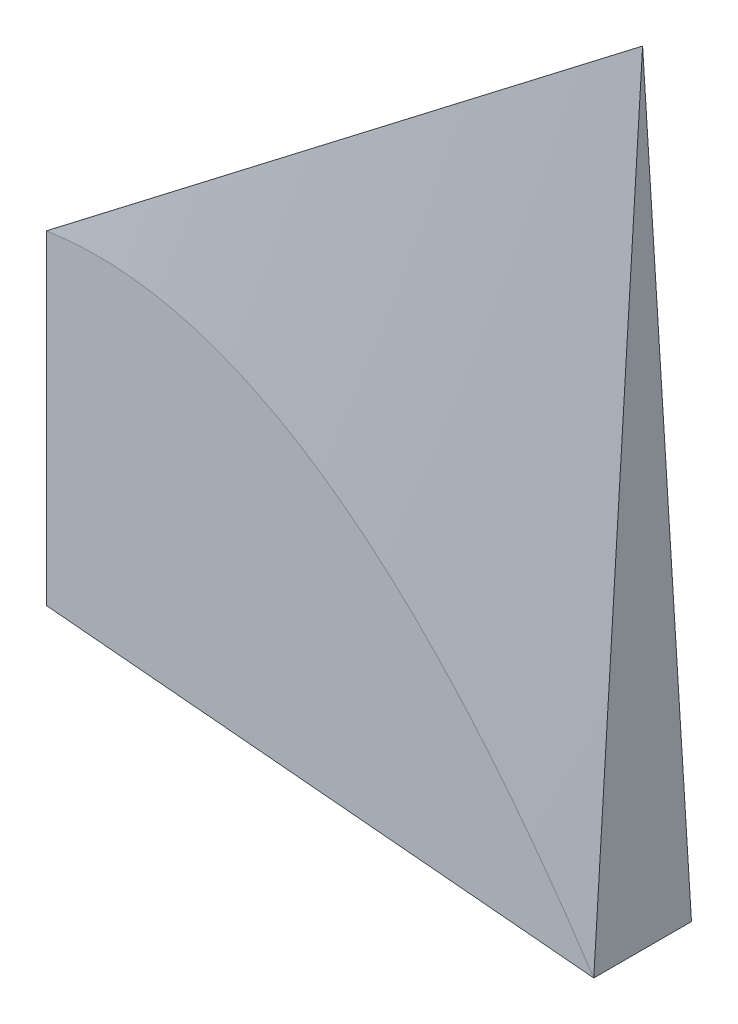
ISO-10303-21;
HEADER;
FILE_DESCRIPTION(('STEP AP214'),'2;1');
FILE_NAME('part.step','',(''),(''),'','','');
FILE_SCHEMA(('AUTOMOTIVE_DESIGN { 1 0 10303 214 1 1 1 1 }'));
ENDSEC;
DATA;
#1=APPLICATION_CONTEXT('core data for automotive mechanical design processes');
#2=APPLICATION_PROTOCOL_DEFINITION('international standard','automotive_design',2000,#1);
#3=PRODUCT_CONTEXT('',#1,'mechanical');
#4=PRODUCT('Part','Part','',(#3));
#5=PRODUCT_RELATED_PRODUCT_CATEGORY('part','',(#4));
#6=PRODUCT_DEFINITION_FORMATION('','',#4);
#7=PRODUCT_DEFINITION_CONTEXT('part definition',#1,'design');
#8=PRODUCT_DEFINITION('design','',#6,#7);
#9=PRODUCT_DEFINITION_SHAPE('','',#8);
#10=(LENGTH_UNIT() NAMED_UNIT(*) SI_UNIT(.MILLI.,.METRE.));
#11=(NAMED_UNIT(*) PLANE_ANGLE_UNIT() SI_UNIT($,.RADIAN.));
#12=(NAMED_UNIT(*) SI_UNIT($,.STERADIAN.) SOLID_ANGLE_UNIT());
#13=UNCERTAINTY_MEASURE_WITH_UNIT(LENGTH_MEASURE(1.E-05),#10,'distance_accuracy_value','');
#14=(GEOMETRIC_REPRESENTATION_CONTEXT(3) GLOBAL_UNCERTAINTY_ASSIGNED_CONTEXT((#13)) GLOBAL_UNIT_ASSIGNED_CONTEXT((#10,
#11,#12)) REPRESENTATION_CONTEXT('',''));
#15=CARTESIAN_POINT('',(0.,0.,0.));
#16=DIRECTION('',(0.,0.,1.));
#17=DIRECTION('',(1.,0.,0.));
#18=AXIS2_PLACEMENT_3D('',#15,#16,#17);
#19=CARTESIAN_POINT('',(-57.3898696737222,209.107539295599,-5.));
#20=DIRECTION('',(-0.0816932394452715,0.,-0.996657521232313));
#21=DIRECTION('',(-0.996657521232313,0.,0.0816932394452715));
#22=AXIS2_PLACEMENT_3D('',#19,#20,#21);
#23=PLANE('',#22);
#24=DIRECTION('',(0.,-1.,0.));
#25=VECTOR('',#24,1.);
#26=CARTESIAN_POINT('',(-118.389869673722,209.107539295599,0.));
#27=LINE('',#26,#25);
#28=CARTESIAN_POINT('',(-118.389869673722,162.229328701854,0.));
#29=VERTEX_POINT('',#28);
#30=CARTESIAN_POINT('',(-118.389869673722,129.01017756827,0.));
#31=VERTEX_POINT('',#30);
#32=EDGE_CURVE('E109',#29,#31,#27,.T.);
#33=ORIENTED_EDGE('',*,*,#32,.F.);
#34=CARTESIAN_POINT('',(-118.389869673722,162.229328701854,0.));
#35=CARTESIAN_POINT('',(-117.824380542119,162.355969689664,-0.0463515681642313));
#36=CARTESIAN_POINT('',(-117.256296544394,162.471052145065,-0.0929158302727899));
#37=CARTESIAN_POINT('',(-116.115789424922,162.677437617152,-0.18640002039343));
#38=CARTESIAN_POINT('',(-115.543365807945,162.768737876501,-0.233319988998147));
#39=CARTESIAN_POINT('',(-114.395163558519,162.926866640521,-0.327434927475638));
#40=CARTESIAN_POINT('',(-113.819384937805,162.993695230728,-0.374629896386613));
#41=CARTESIAN_POINT('',(-112.665505551011,163.10239687442,-0.469210173992756));
#42=CARTESIAN_POINT('',(-112.087404852786,163.144270651873,-0.51659547712595));
#43=CARTESIAN_POINT('',(-110.93444378709,163.202521296922,-0.611100482510846));
#44=CARTESIAN_POINT('',(-110.359593274545,163.219094311488,-0.658219376981737));
#45=CARTESIAN_POINT('',(-109.209756228394,163.227239871508,-0.752468315190832));
#46=CARTESIAN_POINT('',(-108.634769707207,163.218814176246,-0.799598357911074));
#47=CARTESIAN_POINT('',(-107.485729070081,163.177030259968,-0.893782016691937));
#48=CARTESIAN_POINT('',(-106.911674906995,163.143673341631,-0.94083563661698));
#49=CARTESIAN_POINT('',(-105.765560254576,163.052279414079,-1.03477946058574));
#50=CARTESIAN_POINT('',(-105.193499646028,162.994243907105,-1.0816696744012));
#51=CARTESIAN_POINT('',(-104.051861933743,162.853856149026,-1.17524653606387));
#52=CARTESIAN_POINT('',(-103.482287353101,162.771483279022,-1.2219329771001));
#53=CARTESIAN_POINT('',(-102.347022310497,162.583016216278,-1.31498748878894));
#54=CARTESIAN_POINT('',(-101.781332081212,162.476920615077,-1.36135554036966));
#55=CARTESIAN_POINT('',(-100.654699035431,162.241724683276,-1.45370251133531));
#56=CARTESIAN_POINT('',(-100.093756472759,162.112623130748,-1.49968140991501));
#57=CARTESIAN_POINT('',(-98.9774545486244,161.832262929107,-1.59118156763097));
#58=CARTESIAN_POINT('',(-98.4220947553649,161.681006007904,-1.63670286216044));
#59=CARTESIAN_POINT('',(-97.3170850647655,161.357104321196,-1.72727742696366));
#60=CARTESIAN_POINT('',(-96.7674406175545,161.184440866209,-1.77233025050555));
#61=CARTESIAN_POINT('',(-95.674941522028,160.818824519741,-1.86187935669624));
#62=CARTESIAN_POINT('',(-95.1320864969825,160.625872759653,-1.90637567022456));
#63=CARTESIAN_POINT('',(-94.0535393061239,160.220674930859,-1.99478117767199));
#64=CARTESIAN_POINT('',(-93.5178476625308,160.008427464173,-2.03869032878618));
#65=CARTESIAN_POINT('',(-92.4540014350187,159.565681194222,-2.12589083923799));
#66=CARTESIAN_POINT('',(-91.9258472234937,159.335181492848,-2.16918216805152));
#67=CARTESIAN_POINT('',(-90.5785996255444,158.720706611979,-2.27961229903096));
#68=CARTESIAN_POINT('',(-89.7651955902015,158.324114256618,-2.34628476094432));
#69=CARTESIAN_POINT('',(-88.1580054124345,157.492285345728,-2.47802166076128));
#70=CARTESIAN_POINT('',(-87.3642260884769,157.057035593628,-2.5430855397742));
#71=CARTESIAN_POINT('',(-85.7963995808165,156.15150931156,-2.67159590925456));
#72=CARTESIAN_POINT('',(-85.0223601582561,155.681219281322,-2.73504176356279));
#73=CARTESIAN_POINT('',(-83.494213055892,154.709200044796,-2.86029972277296));
#74=CARTESIAN_POINT('',(-82.7401050605221,154.207471336687,-2.92211185354099));
#75=CARTESIAN_POINT('',(-81.2467624707613,153.172459936594,-3.04451698384926));
#76=CARTESIAN_POINT('',(-80.507650683938,152.638999224024,-3.10509991719542));
#77=CARTESIAN_POINT('',(-79.0488796157879,151.54644007272,-3.22467131622412));
#78=CARTESIAN_POINT('',(-78.3292145646094,150.987349374163,-3.28366025484531));
#79=CARTESIAN_POINT('',(-76.9084859906282,149.845985688847,-3.40011341664705));
#80=CARTESIAN_POINT('',(-76.2074213423186,149.263714110115,-3.45757773208226));
#81=CARTESIAN_POINT('',(-74.8231726855399,148.078289954786,-3.57104073673625));
#82=CARTESIAN_POINT('',(-74.1399873822031,147.475138897722,-3.62703953209173));
#83=CARTESIAN_POINT('',(-72.7167265377402,146.18279554968,-3.7437002570477));
#84=CARTESIAN_POINT('',(-71.9786228757742,145.491418544033,-3.80420055720885));
#85=CARTESIAN_POINT('',(-70.5223704783819,144.087850828621,-3.92356550781477));
#86=CARTESIAN_POINT('',(-69.8042218732866,143.375659982979,-3.98243014757669));
#87=CARTESIAN_POINT('',(-68.3867085915415,141.932464106316,-4.09861976083448));
#88=CARTESIAN_POINT('',(-67.687347442721,141.201455591566,-4.15594444516403));
#89=CARTESIAN_POINT('',(-66.3064025895966,139.722471793846,-4.2691366462398));
#90=CARTESIAN_POINT('',(-65.6248224654933,138.974493149776,-4.32500386952696));
#91=CARTESIAN_POINT('',(-64.2907527853504,137.476966107161,-4.43435384330916));
#92=CARTESIAN_POINT('',(-63.6379603160039,136.727689032435,-4.48786142276379));
#93=CARTESIAN_POINT('',(-62.3479560764197,135.215958202527,-4.59359947518872));
#94=CARTESIAN_POINT('',(-61.7107419860603,134.453506438707,-4.64583013833294));
#95=CARTESIAN_POINT('',(-60.4512804922036,132.916897974395,-4.74906468700972));
#96=CARTESIAN_POINT('',(-59.8290259219071,132.142747180335,-4.80006915998484));
#97=CARTESIAN_POINT('',(-58.5989615051504,130.584114965958,-4.90089411217801));
#98=CARTESIAN_POINT('',(-57.9911390717322,129.799643550163,-4.95071562311393));
#99=CARTESIAN_POINT('',(-57.3898696737222,129.01017756827,-5.));
#100=B_SPLINE_CURVE_WITH_KNOTS('',3,(#34,#35,#36,#37,#38,#39,#40,#41,#42,#43,#44,#45,#46,#47,
#48,#49,#50,#51,#52,#53,#54,#55,#56,#57,#58,#59,#60,#61,#62,#63,#64,#65,#66,#67,#68,#69,#70,#71,
#72,#73,#74,#75,#76,#77,#78,#79,#80,#81,#82,#83,#84,#85,#86,#87,#88,#89,#90,#91,#92,#93,#94,#95,
#96,#97,#98,#99),.UNSPECIFIED.,.F.,.F.,(4,2,2,2,2,2,2,2,2,2,2,2,2,2,2,2,2,2,2,2,2,2,2,2,2,2,2,2,
2,2,2,2,4),(0.,1.74395510831159,3.48811232304952,5.23226344134731,6.97636395732546,
8.7068732187396,10.4372606985686,12.1675577705282,13.897749530645,15.6294113535653,
17.3611760157311,19.0930326855205,20.824754358634,22.5579987425571,24.2911465220465,
26.0244199689359,27.7577787554336,30.4787473317283,33.2006483685246,35.923603573057,
38.6465156403007,41.3864897520713,44.1256417822331,46.8646276870382,49.6034146754738,
52.6423879957377,55.6813811595582,58.7209410394075,61.7611082819893,64.7464754162658,
67.7313951908729,70.7148552438471,73.6956098607786),.UNSPECIFIED.);
#101=CARTESIAN_POINT('',(-57.3898696737222,129.01017756827,-5.));
#102=VERTEX_POINT('',#101);
#103=EDGE_CURVE('E106',#29,#102,#100,.T.);
#104=ORIENTED_EDGE('',*,*,#103,.T.);
#105=DIRECTION('',(0.996657521232313,0.,-0.0816932394452715));
#106=VECTOR('',#105,1.);
#107=CARTESIAN_POINT('',(-57.3898696737222,129.01017756827,-5.));
#108=LINE('',#107,#106);
#109=EDGE_CURVE('E76',#31,#102,#108,.T.);
#110=ORIENTED_EDGE('',*,*,#109,.F.);
#111=EDGE_LOOP('',(#33,#104,#110));
#112=FACE_BOUND('',#111,.T.);
#113=ADVANCED_FACE('F55',(#112),#23,.T.);
#114=CARTESIAN_POINT('',(-118.389869673722,209.107539295599,0.));
#115=DIRECTION('',(-0.0816932394452715,0.,0.996657521232313));
#116=DIRECTION('',(0.996657521232313,0.,0.0816932394452715));
#117=AXIS2_PLACEMENT_3D('',#114,#115,#116);
#118=PLANE('',#117);
#119=DIRECTION('',(-0.996657521232313,0.,-0.0816932394452715));
#120=VECTOR('',#119,1.);
#121=CARTESIAN_POINT('',(-118.389869673722,129.01017756827,0.));
#122=LINE('',#121,#120);
#123=CARTESIAN_POINT('',(-57.3898696737222,129.01017756827,5.));
#124=VERTEX_POINT('',#123);
#125=EDGE_CURVE('E72',#124,#31,#122,.T.);
#126=ORIENTED_EDGE('',*,*,#125,.F.);
#127=CARTESIAN_POINT('',(-57.3898696737222,129.01017756827,5.));
#128=CARTESIAN_POINT('',(-57.7738046828719,129.514300871457,4.96852991728281));
#129=CARTESIAN_POINT('',(-58.1604123003091,130.016370722326,4.93684076831254));
#130=CARTESIAN_POINT('',(-58.9391767051212,131.016171750337,4.87300762037713));
#131=CARTESIAN_POINT('',(-59.3313335849945,131.513902854933,4.84086361383013));
#132=CARTESIAN_POINT('',(-60.5217143340933,133.006861959874,4.74329142128106));
#133=CARTESIAN_POINT('',(-61.3287032256543,133.995085535536,4.67714479082524));
#134=CARTESIAN_POINT('',(-62.9713063639371,135.954980850792,4.54250518932665));
#135=CARTESIAN_POINT('',(-63.8070339956407,136.926557005214,4.47400292443291));
#136=CARTESIAN_POINT('',(-65.5076553931375,138.848209307354,4.33460772791677));
#137=CARTESIAN_POINT('',(-66.3726189633139,139.798223391193,4.26370907462363));
#138=CARTESIAN_POINT('',(-68.1324104718807,141.671635395113,4.1194638690034));
#139=CARTESIAN_POINT('',(-69.0272643065943,142.595008872131,4.04611519402688));
#140=CARTESIAN_POINT('',(-70.8804858512048,144.442483475321,3.89421178873093));
#141=CARTESIAN_POINT('',(-71.8399805631934,145.365449724667,3.81556468119088));
#142=CARTESIAN_POINT('',(-73.7935265676139,147.171193906483,3.65543795951707));
#143=CARTESIAN_POINT('',(-74.7875293847623,148.0540244874,3.57396231876721));
#144=CARTESIAN_POINT('',(-76.81185590123,149.773035031308,3.40803391577804));
#145=CARTESIAN_POINT('',(-77.8421101806096,150.609296999582,3.32358684369776));
#146=CARTESIAN_POINT('',(-79.9410837880274,152.228182796475,3.15153982669629));
#147=CARTESIAN_POINT('',(-81.0097367948471,153.010892910873,3.06394531794058));
#148=CARTESIAN_POINT('',(-83.1882835731542,154.515116432009,2.88537590988262));
#149=CARTESIAN_POINT('',(-84.2981508120503,155.236668261213,2.79440318538294));
#150=CARTESIAN_POINT('',(-86.1906370398254,156.384594075629,2.63928136343416));
#151=CARTESIAN_POINT('',(-86.9616106234589,156.830345891941,2.57608680739863));
#152=CARTESIAN_POINT('',(-88.5230884895058,157.686495451709,2.44809681837839));
#153=CARTESIAN_POINT('',(-89.3135965720216,158.096886245496,2.38330107390988));
#154=CARTESIAN_POINT('',(-90.9137062592171,158.878613491519,2.25214454217255));
#155=CARTESIAN_POINT('',(-91.7233096240021,159.249946326234,2.18578361063279));
#156=CARTESIAN_POINT('',(-93.3551834651194,159.947341914831,2.05202345972154));
#157=CARTESIAN_POINT('',(-94.1773295598443,160.273696707321,1.98463443556376));
#158=CARTESIAN_POINT('',(-95.8383547824239,160.880354907772,1.8484848271556));
#159=CARTESIAN_POINT('',(-96.6772334996031,161.160659444407,1.77972427656713));
#160=CARTESIAN_POINT('',(-98.3699310611988,161.671585705872,1.640978574797));
#161=CARTESIAN_POINT('',(-99.2237491578606,161.902209909683,1.57099348490669));
#162=CARTESIAN_POINT('',(-100.738757007148,162.261785586181,1.44681251365366));
#163=CARTESIAN_POINT('',(-101.397338514855,162.401868240121,1.39283042285799));
#164=CARTESIAN_POINT('',(-102.720570094274,162.650068814682,1.28436881798755));
#165=CARTESIAN_POINT('',(-103.385220886978,162.758182885351,1.22988924481512));
#166=CARTESIAN_POINT('',(-104.719066297379,162.94138992127,1.1205576537986));
#167=CARTESIAN_POINT('',(-105.388261125287,163.016481348156,1.06570561872418));
#168=CARTESIAN_POINT('',(-106.729651564086,163.132899290696,0.95575558275709));
#169=CARTESIAN_POINT('',(-107.401847525466,163.174221753101,0.900657553135789));
#170=CARTESIAN_POINT('',(-108.746893426967,163.222644655852,0.790407889078273));
#171=CARTESIAN_POINT('',(-109.419742328132,163.22977410588,0.735256339802506));
#172=CARTESIAN_POINT('',(-110.764961908664,163.209815285668,0.624992439758845));
#173=CARTESIAN_POINT('',(-111.437332569972,163.182725785346,0.569880090471348));
#174=CARTESIAN_POINT('',(-112.779611039936,163.094622487519,0.459857265064473));
#175=CARTESIAN_POINT('',(-113.449519621985,163.033620460636,0.404946725552205));
#176=CARTESIAN_POINT('',(-114.784982067439,162.8783646272,0.29548259067892));
#177=CARTESIAN_POINT('',(-115.450539017333,162.784137781294,0.240928742326969));
#178=CARTESIAN_POINT('',(-116.304193779409,162.641971198784,0.170957040517459));
#179=CARTESIAN_POINT('',(-116.494822686821,162.608846457726,0.155331720237828));
#180=CARTESIAN_POINT('',(-116.875570725902,162.539949591644,0.124122864575451));
#181=CARTESIAN_POINT('',(-117.065689948307,162.504177975443,0.108539321755376));
#182=CARTESIAN_POINT('',(-117.445117922063,162.430067863702,0.077438668168762));
#183=CARTESIAN_POINT('',(-117.63442747933,162.391733512927,0.0619214913436498));
#184=CARTESIAN_POINT('',(-118.012542828369,162.312469330418,0.0309284299469752));
#185=CARTESIAN_POINT('',(-118.201348520054,162.271539017976,0.0154525535793976));
#186=CARTESIAN_POINT('',(-118.389869673722,162.229328701854,0.));
#187=B_SPLINE_CURVE_WITH_KNOTS('',3,(#127,#128,#129,#130,#131,#132,#133,#134,#135,#136,#137,
#138,#139,#140,#141,#142,#143,#144,#145,#146,#147,#148,#149,#150,#151,#152,#153,#154,#155,#156,
#157,#158,#159,#160,#161,#162,#163,#164,#165,#166,#167,#168,#169,#170,#171,#172,#173,#174,#175,
#176,#177,#178,#179,#180,#181,#182,#183,#184,#185,#186),.UNSPECIFIED.,.F.,.F.,(4,2,2,2,2,2,2,2,
2,2,2,2,2,2,2,2,2,2,2,2,2,2,2,2,2,2,2,2,2,4),(0.,1.90335572144747,3.80674320665012,
7.63905375195471,11.4887736409031,15.348444195281,19.2115501525725,23.2116191016528,
27.2062798581692,31.1936679917587,35.1744722660809,39.1527567857045,41.8303559921682,
44.5084802452356,47.18685232633,49.8469200502429,52.5069225671907,55.1667923228443,
57.192493742664,59.2184390169149,61.2444786600689,63.2707614506415,65.2953248189039,
67.319960967013,69.3438948271348,71.3661901090326,71.9485264077527,72.5307510501693,
73.1120558221702,73.6934685537267),.UNSPECIFIED.);
#188=EDGE_CURVE('E101',#124,#29,#187,.T.);
#189=ORIENTED_EDGE('',*,*,#188,.T.);
#190=ORIENTED_EDGE('',*,*,#32,.T.);
#191=EDGE_LOOP('',(#126,#189,#190));
#192=FACE_BOUND('',#191,.T.);
#193=ADVANCED_FACE('F108',(#192),#118,.T.);
#194=CARTESIAN_POINT('',(-57.3898696737222,0.,0.));
#195=DIRECTION('',(-1.,0.,0.));
#196=DIRECTION('',(0.,-1.,0.));
#197=AXIS2_PLACEMENT_3D('',#194,#195,#196);
#198=PLANE('',#197);
#199=DIRECTION('',(0.,0.,-1.));
#200=VECTOR('',#199,1.);
#201=CARTESIAN_POINT('',(-57.3898696737222,129.01017756827,-5.));
#202=LINE('',#201,#200);
#203=EDGE_CURVE('E85',#124,#102,#202,.T.);
#204=ORIENTED_EDGE('',*,*,#203,.T.);
#205=DIRECTION('',(0.,0.998057242967816,0.0623036095220954));
#206=VECTOR('',#205,1.);
#207=CARTESIAN_POINT('',(-57.3898696737222,209.106439295599,0.));
#208=LINE('',#207,#206);
#209=CARTESIAN_POINT('',(-57.3898696737222,209.106439295599,0.));
#210=VERTEX_POINT('',#209);
#211=EDGE_CURVE('E12',#102,#210,#208,.T.);
#212=ORIENTED_EDGE('',*,*,#211,.T.);
#213=DIRECTION('',(0.,-0.998057242967816,0.0623036095220954));
#214=VECTOR('',#213,1.);
#215=CARTESIAN_POINT('',(-57.3898696737222,129.01017756827,5.));
#216=LINE('',#215,#214);
#217=EDGE_CURVE('E65',#210,#124,#216,.T.);
#218=ORIENTED_EDGE('',*,*,#217,.T.);
#219=EDGE_LOOP('',(#204,#212,#218));
#220=FACE_BOUND('',#219,.T.);
#221=ADVANCED_FACE('F57',(#220),#198,.F.);
#222=CARTESIAN_POINT('',(-118.389869673722,129.01017756827,-5.));
#223=CARTESIAN_POINT('',(-57.3898696737222,129.01017756827,-5.));
#224=CARTESIAN_POINT('',(-118.389869673722,134.546702757201,-4.16666666666666));
#225=CARTESIAN_POINT('',(-57.3898696737222,142.359554522825,-4.16666666666665));
#226=CARTESIAN_POINT('',(-118.389869673722,140.083227946131,-3.33333333333332));
#227=CARTESIAN_POINT('',(-57.3898696737222,155.70893147738,-3.33333333333331));
#228=CARTESIAN_POINT('',(-118.389869673722,151.156278323993,-1.66666666666665));
#229=CARTESIAN_POINT('',(-57.3898696737222,182.40768538649,-1.66666666666665));
#230=CARTESIAN_POINT('',(-118.389869673722,156.692803512923,-0.833333333333324));
#231=CARTESIAN_POINT('',(-57.3898696737222,195.757062341044,-0.833333333333321));
#232=CARTESIAN_POINT('',(-118.389869673722,162.229328701854,0.));
#233=CARTESIAN_POINT('',(-57.3898696737222,209.106439295599,0.));
#234=B_SPLINE_SURFACE_WITH_KNOTS('',3,1,((#222,#223),(#224,#225),(#226,#227),(#228,#229),(#230,
#231),(#232,#233)),.UNSPECIFIED.,.F.,.F.,.F.,(4,2,4),(2,2),(0.,0.5,1.),(0.,1.),.UNSPECIFIED.);
#235=DIRECTION('',(0.792912653153504,0.609335313656669,0.));
#236=VECTOR('',#235,1.);
#237=CARTESIAN_POINT('',(-87.8898696737222,185.667883998726,0.));
#238=LINE('',#237,#236);
#239=EDGE_CURVE('E91',#29,#210,#238,.T.);
#240=ORIENTED_EDGE('',*,*,#211,.F.);
#241=ORIENTED_EDGE('',*,*,#103,.F.);
#242=ORIENTED_EDGE('',*,*,#239,.T.);
#243=EDGE_LOOP('',(#240,#241,#242));
#244=FACE_BOUND('',#243,.T.);
#245=ADVANCED_FACE('F132',(#244),#234,.T.);
#246=CARTESIAN_POINT('',(-118.389869673722,162.229328701854,0.));
#247=CARTESIAN_POINT('',(-57.3898696737222,209.106439295599,0.));
#248=CARTESIAN_POINT('',(-118.389869673722,156.692803512923,0.833333333333345));
#249=CARTESIAN_POINT('',(-57.3898696737222,195.757062341045,0.833333333333313));
#250=CARTESIAN_POINT('',(-118.389869673722,151.156278323992,1.66666666666668));
#251=CARTESIAN_POINT('',(-57.3898696737222,182.40768538649,1.66666666666664));
#252=CARTESIAN_POINT('',(-118.389869673722,140.083227946131,3.33333333333335));
#253=CARTESIAN_POINT('',(-57.3898696737222,155.70893147738,3.3333333333333));
#254=CARTESIAN_POINT('',(-118.389869673722,134.5467027572,4.16666666666668));
#255=CARTESIAN_POINT('',(-57.3898696737222,142.359554522825,4.16666666666665));
#256=CARTESIAN_POINT('',(-118.389869673722,129.01017756827,5.));
#257=CARTESIAN_POINT('',(-57.3898696737222,129.01017756827,5.));
#258=B_SPLINE_SURFACE_WITH_KNOTS('',3,1,((#246,#247),(#248,#249),(#250,#251),(#252,#253),(#254,
#255),(#256,#257)),.UNSPECIFIED.,.F.,.F.,.F.,(4,2,4),(2,2),(0.,0.5,1.),(0.,1.),.UNSPECIFIED.);
#259=ORIENTED_EDGE('',*,*,#239,.F.);
#260=ORIENTED_EDGE('',*,*,#188,.F.);
#261=ORIENTED_EDGE('',*,*,#217,.F.);
#262=EDGE_LOOP('',(#259,#260,#261));
#263=FACE_BOUND('',#262,.T.);
#264=ADVANCED_FACE('F102',(#263),#258,.T.);
#265=CARTESIAN_POINT('',(0.,129.01017756827,0.));
#266=DIRECTION('',(0.,1.,0.));
#267=DIRECTION('',(0.,0.,1.));
#268=AXIS2_PLACEMENT_3D('',#265,#266,#267);
#269=PLANE('',#268);
#270=ORIENTED_EDGE('',*,*,#109,.T.);
#271=ORIENTED_EDGE('',*,*,#203,.F.);
#272=ORIENTED_EDGE('',*,*,#125,.T.);
#273=EDGE_LOOP('',(#270,#271,#272));
#274=FACE_BOUND('',#273,.T.);
#275=ADVANCED_FACE('F87',(#274),#269,.F.);
#276=CLOSED_SHELL('',(#113,#193,#221,#245,#264,#275));
#277=MANIFOLD_SOLID_BREP('B2',#276);
#278=ADVANCED_BREP_SHAPE_REPRESENTATION('',(#18,#277),#14);
#279=SHAPE_DEFINITION_REPRESENTATION(#9,#278);
ENDSEC;
END-ISO-10303-21;
